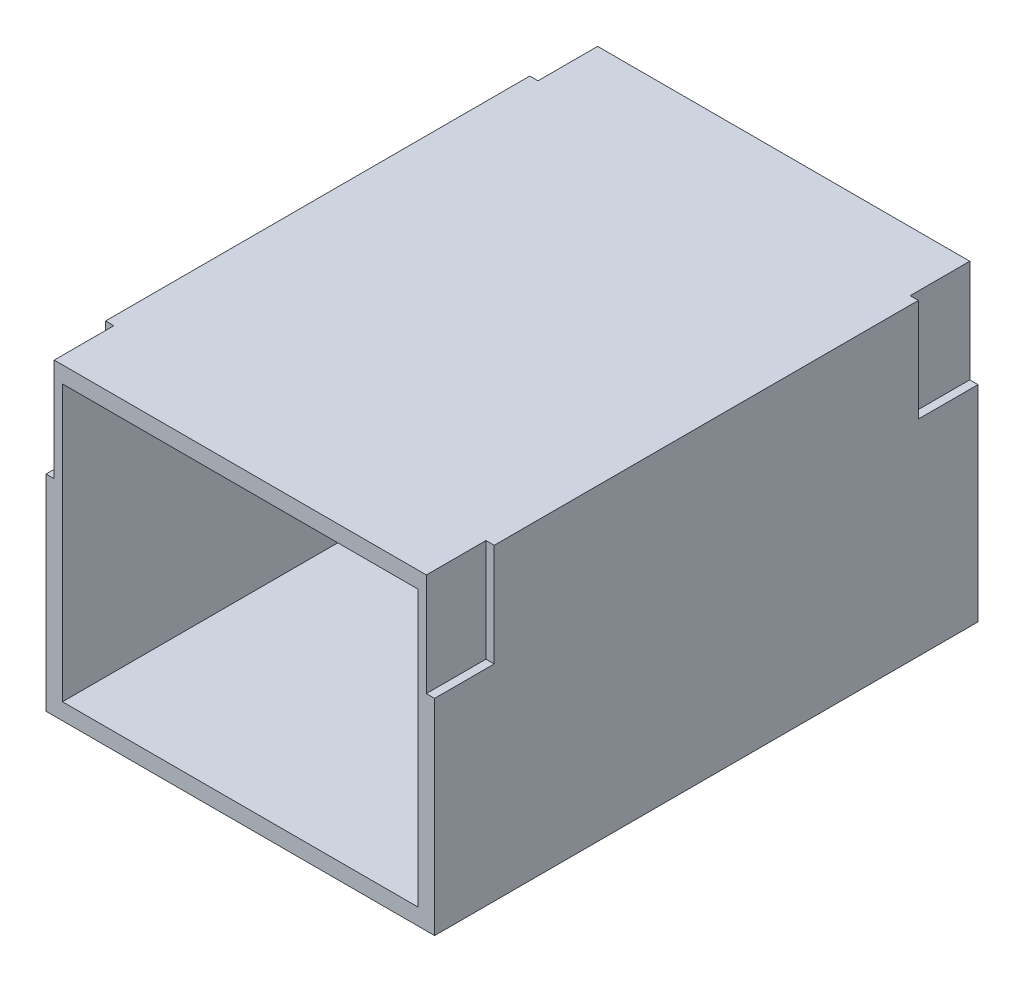
ISO-10303-21;
HEADER;
FILE_DESCRIPTION(('STEP AP214'),'2;1');
FILE_NAME('part.step','',(''),(''),'','','');
FILE_SCHEMA(('AUTOMOTIVE_DESIGN { 1 0 10303 214 1 1 1 1 }'));
ENDSEC;
DATA;
#1=APPLICATION_CONTEXT('core data for automotive mechanical design processes');
#2=APPLICATION_PROTOCOL_DEFINITION('international standard','automotive_design',2000,#1);
#3=PRODUCT_CONTEXT('',#1,'mechanical');
#4=PRODUCT('Part','Part','',(#3));
#5=PRODUCT_RELATED_PRODUCT_CATEGORY('part','',(#4));
#6=PRODUCT_DEFINITION_FORMATION('','',#4);
#7=PRODUCT_DEFINITION_CONTEXT('part definition',#1,'design');
#8=PRODUCT_DEFINITION('design','',#6,#7);
#9=PRODUCT_DEFINITION_SHAPE('','',#8);
#10=(LENGTH_UNIT() NAMED_UNIT(*) SI_UNIT(.MILLI.,.METRE.));
#11=(NAMED_UNIT(*) PLANE_ANGLE_UNIT() SI_UNIT($,.RADIAN.));
#12=(NAMED_UNIT(*) SI_UNIT($,.STERADIAN.) SOLID_ANGLE_UNIT());
#13=UNCERTAINTY_MEASURE_WITH_UNIT(LENGTH_MEASURE(1.E-05),#10,'distance_accuracy_value','');
#14=(GEOMETRIC_REPRESENTATION_CONTEXT(3) GLOBAL_UNCERTAINTY_ASSIGNED_CONTEXT((#13)) GLOBAL_UNIT_ASSIGNED_CONTEXT((#10,
#11,#12)) REPRESENTATION_CONTEXT('',''));
#15=CARTESIAN_POINT('',(0.,0.,0.));
#16=DIRECTION('',(0.,0.,1.));
#17=DIRECTION('',(1.,0.,0.));
#18=AXIS2_PLACEMENT_3D('',#15,#16,#17);
#19=CARTESIAN_POINT('',(3.175,56.261,-104.775));
#20=DIRECTION('',(-1.,0.,0.));
#21=DIRECTION('',(0.,0.,1.));
#22=AXIS2_PLACEMENT_3D('',#19,#20,#21);
#23=PLANE('',#22);
#24=DIRECTION('',(0.,1.,0.));
#25=VECTOR('',#24,1.);
#26=CARTESIAN_POINT('',(3.175,56.261,-103.1875));
#27=LINE('',#26,#25);
#28=CARTESIAN_POINT('',(3.175,3.175,-103.1875));
#29=VERTEX_POINT('',#28);
#30=CARTESIAN_POINT('',(3.175,56.261,-103.1875));
#31=VERTEX_POINT('',#30);
#32=EDGE_CURVE('E48',#29,#31,#27,.T.);
#33=ORIENTED_EDGE('',*,*,#32,.T.);
#34=DIRECTION('',(0.,0.,1.));
#35=VECTOR('',#34,1.);
#36=CARTESIAN_POINT('',(3.175,56.261,-104.775));
#37=LINE('',#36,#35);
#38=CARTESIAN_POINT('',(3.175,56.261,0.));
#39=VERTEX_POINT('',#38);
#40=EDGE_CURVE('E294',#31,#39,#37,.T.);
#41=ORIENTED_EDGE('',*,*,#40,.T.);
#42=DIRECTION('',(0.,-1.,0.));
#43=VECTOR('',#42,1.);
#44=CARTESIAN_POINT('',(3.175,56.261,0.));
#45=LINE('',#44,#43);
#46=CARTESIAN_POINT('',(3.175,3.175,0.));
#47=VERTEX_POINT('',#46);
#48=EDGE_CURVE('E281',#39,#47,#45,.T.);
#49=ORIENTED_EDGE('',*,*,#48,.T.);
#50=DIRECTION('',(0.,0.,1.));
#51=VECTOR('',#50,1.);
#52=CARTESIAN_POINT('',(3.175,3.175,-104.775));
#53=LINE('',#52,#51);
#54=EDGE_CURVE('E180',#29,#47,#53,.T.);
#55=ORIENTED_EDGE('',*,*,#54,.F.);
#56=EDGE_LOOP('',(#33,#41,#49,#55));
#57=FACE_BOUND('',#56,.T.);
#58=ADVANCED_FACE('F31',(#57),#23,.F.);
#59=CARTESIAN_POINT('',(71.755,56.261,-104.775));
#60=DIRECTION('',(0.,1.,0.));
#61=DIRECTION('',(0.,0.,1.));
#62=AXIS2_PLACEMENT_3D('',#59,#60,#61);
#63=PLANE('',#62);
#64=DIRECTION('',(1.,0.,0.));
#65=VECTOR('',#64,1.);
#66=CARTESIAN_POINT('',(71.755,56.261,-103.1875));
#67=LINE('',#66,#65);
#68=CARTESIAN_POINT('',(71.755,56.261,-103.1875));
#69=VERTEX_POINT('',#68);
#70=EDGE_CURVE('E55',#31,#69,#67,.T.);
#71=ORIENTED_EDGE('',*,*,#70,.T.);
#72=DIRECTION('',(0.,0.,1.));
#73=VECTOR('',#72,1.);
#74=CARTESIAN_POINT('',(71.755,56.261,-104.775));
#75=LINE('',#74,#73);
#76=CARTESIAN_POINT('',(71.755,56.261,0.));
#77=VERTEX_POINT('',#76);
#78=EDGE_CURVE('E179',#69,#77,#75,.T.);
#79=ORIENTED_EDGE('',*,*,#78,.T.);
#80=DIRECTION('',(-1.,0.,0.));
#81=VECTOR('',#80,1.);
#82=CARTESIAN_POINT('',(71.755,56.261,0.));
#83=LINE('',#82,#81);
#84=EDGE_CURVE('E291',#77,#39,#83,.T.);
#85=ORIENTED_EDGE('',*,*,#84,.T.);
#86=ORIENTED_EDGE('',*,*,#40,.F.);
#87=EDGE_LOOP('',(#71,#79,#85,#86));
#88=FACE_BOUND('',#87,.T.);
#89=ADVANCED_FACE('F388',(#88),#63,.F.);
#90=CARTESIAN_POINT('',(71.755,56.261,-104.775));
#91=DIRECTION('',(1.,0.,0.));
#92=DIRECTION('',(0.,0.,-1.));
#93=AXIS2_PLACEMENT_3D('',#90,#91,#92);
#94=PLANE('',#93);
#95=DIRECTION('',(0.,-1.,0.));
#96=VECTOR('',#95,1.);
#97=CARTESIAN_POINT('',(71.755,56.261,-103.1875));
#98=LINE('',#97,#96);
#99=CARTESIAN_POINT('',(71.755,3.175,-103.1875));
#100=VERTEX_POINT('',#99);
#101=EDGE_CURVE('E183',#69,#100,#98,.T.);
#102=ORIENTED_EDGE('',*,*,#101,.T.);
#103=DIRECTION('',(0.,0.,1.));
#104=VECTOR('',#103,1.);
#105=CARTESIAN_POINT('',(71.755,3.175,-104.775));
#106=LINE('',#105,#104);
#107=CARTESIAN_POINT('',(71.755,3.175,0.));
#108=VERTEX_POINT('',#107);
#109=EDGE_CURVE('E169',#100,#108,#106,.T.);
#110=ORIENTED_EDGE('',*,*,#109,.T.);
#111=DIRECTION('',(0.,1.,0.));
#112=VECTOR('',#111,1.);
#113=CARTESIAN_POINT('',(71.755,56.261,0.));
#114=LINE('',#113,#112);
#115=EDGE_CURVE('E289',#108,#77,#114,.T.);
#116=ORIENTED_EDGE('',*,*,#115,.T.);
#117=ORIENTED_EDGE('',*,*,#78,.F.);
#118=EDGE_LOOP('',(#102,#110,#116,#117));
#119=FACE_BOUND('',#118,.T.);
#120=ADVANCED_FACE('F184',(#119),#94,.F.);
#121=CARTESIAN_POINT('',(71.755,3.175,-104.775));
#122=DIRECTION('',(0.,-1.,0.));
#123=DIRECTION('',(1.,0.,0.));
#124=AXIS2_PLACEMENT_3D('',#121,#122,#123);
#125=PLANE('',#124);
#126=DIRECTION('',(-1.,0.,0.));
#127=VECTOR('',#126,1.);
#128=CARTESIAN_POINT('',(71.755,3.175,-103.1875));
#129=LINE('',#128,#127);
#130=EDGE_CURVE('E173',#100,#29,#129,.T.);
#131=ORIENTED_EDGE('',*,*,#130,.T.);
#132=ORIENTED_EDGE('',*,*,#54,.T.);
#133=DIRECTION('',(1.,0.,0.));
#134=VECTOR('',#133,1.);
#135=CARTESIAN_POINT('',(71.755,3.175,0.));
#136=LINE('',#135,#134);
#137=EDGE_CURVE('E175',#47,#108,#136,.T.);
#138=ORIENTED_EDGE('',*,*,#137,.T.);
#139=ORIENTED_EDGE('',*,*,#109,.F.);
#140=EDGE_LOOP('',(#131,#132,#138,#139));
#141=FACE_BOUND('',#140,.T.);
#142=ADVANCED_FACE('F171',(#141),#125,.F.);
#143=CARTESIAN_POINT('',(0.,0.,-104.775));
#144=DIRECTION('',(-1.,0.,0.));
#145=DIRECTION('',(0.,0.,1.));
#146=AXIS2_PLACEMENT_3D('',#143,#144,#145);
#147=PLANE('',#146);
#148=DIRECTION('',(0.,1.,0.));
#149=VECTOR('',#148,1.);
#150=CARTESIAN_POINT('',(0.,39.624,-93.2815));
#151=LINE('',#150,#149);
#152=CARTESIAN_POINT('',(0.,39.624,-93.2815));
#153=VERTEX_POINT('',#152);
#154=CARTESIAN_POINT('',(0.,59.436,-93.2815));
#155=VERTEX_POINT('',#154);
#156=EDGE_CURVE('E249',#153,#155,#151,.T.);
#157=ORIENTED_EDGE('',*,*,#156,.F.);
#158=DIRECTION('',(0.,0.,1.));
#159=VECTOR('',#158,1.);
#160=CARTESIAN_POINT('',(0.,39.624,-93.2815));
#161=LINE('',#160,#159);
#162=CARTESIAN_POINT('',(0.,39.624,-104.775));
#163=VERTEX_POINT('',#162);
#164=EDGE_CURVE('E238',#163,#153,#161,.T.);
#165=ORIENTED_EDGE('',*,*,#164,.F.);
#166=DIRECTION('',(0.,-1.,0.));
#167=VECTOR('',#166,1.);
#168=CARTESIAN_POINT('',(0.,0.,-104.775));
#169=LINE('',#168,#167);
#170=CARTESIAN_POINT('',(0.,0.,-104.775));
#171=VERTEX_POINT('',#170);
#172=EDGE_CURVE('E299',#163,#171,#169,.T.);
#173=ORIENTED_EDGE('',*,*,#172,.T.);
#174=DIRECTION('',(0.,0.,1.));
#175=VECTOR('',#174,1.);
#176=CARTESIAN_POINT('',(0.,0.,-104.775));
#177=LINE('',#176,#175);
#178=CARTESIAN_POINT('',(0.,0.,0.));
#179=VERTEX_POINT('',#178);
#180=EDGE_CURVE('E35',#171,#179,#177,.T.);
#181=ORIENTED_EDGE('',*,*,#180,.T.);
#182=DIRECTION('',(0.,-1.,0.));
#183=VECTOR('',#182,1.);
#184=CARTESIAN_POINT('',(0.,0.,0.));
#185=LINE('',#184,#183);
#186=CARTESIAN_POINT('',(0.,39.624,0.));
#187=VERTEX_POINT('',#186);
#188=EDGE_CURVE('E296',#187,#179,#185,.T.);
#189=ORIENTED_EDGE('',*,*,#188,.F.);
#190=DIRECTION('',(0.,0.,1.));
#191=VECTOR('',#190,1.);
#192=CARTESIAN_POINT('',(0.,39.624,-11.4935));
#193=LINE('',#192,#191);
#194=CARTESIAN_POINT('',(0.,39.624,-11.4935));
#195=VERTEX_POINT('',#194);
#196=EDGE_CURVE('E261',#195,#187,#193,.T.);
#197=ORIENTED_EDGE('',*,*,#196,.F.);
#198=DIRECTION('',(0.,1.,0.));
#199=VECTOR('',#198,1.);
#200=CARTESIAN_POINT('',(0.,39.624,-11.4935));
#201=LINE('',#200,#199);
#202=CARTESIAN_POINT('',(0.,59.436,-11.4935));
#203=VERTEX_POINT('',#202);
#204=EDGE_CURVE('E278',#195,#203,#201,.T.);
#205=ORIENTED_EDGE('',*,*,#204,.T.);
#206=DIRECTION('',(0.,0.,1.));
#207=VECTOR('',#206,1.);
#208=CARTESIAN_POINT('',(0.,59.436,-104.775));
#209=LINE('',#208,#207);
#210=EDGE_CURVE('E12',#155,#203,#209,.T.);
#211=ORIENTED_EDGE('',*,*,#210,.F.);
#212=EDGE_LOOP('',(#157,#165,#173,#181,#189,#197,#205,#211));
#213=FACE_BOUND('',#212,.T.);
#214=ADVANCED_FACE('F33',(#213),#147,.T.);
#215=CARTESIAN_POINT('',(0.,59.436,-104.775));
#216=DIRECTION('',(0.,1.,0.));
#217=DIRECTION('',(0.,0.,1.));
#218=AXIS2_PLACEMENT_3D('',#215,#216,#217);
#219=PLANE('',#218);
#220=DIRECTION('',(0.,0.,1.));
#221=VECTOR('',#220,1.);
#222=CARTESIAN_POINT('',(73.3425,59.436,-11.4935));
#223=LINE('',#222,#221);
#224=CARTESIAN_POINT('',(73.3425,59.436,-11.4935));
#225=VERTEX_POINT('',#224);
#226=CARTESIAN_POINT('',(73.3425,59.436,0.));
#227=VERTEX_POINT('',#226);
#228=EDGE_CURVE('E197',#225,#227,#223,.T.);
#229=ORIENTED_EDGE('',*,*,#228,.F.);
#230=DIRECTION('',(-1.,0.,0.));
#231=VECTOR('',#230,1.);
#232=CARTESIAN_POINT('',(73.3425,59.436,-11.4935));
#233=LINE('',#232,#231);
#234=CARTESIAN_POINT('',(74.93,59.436,-11.4935));
#235=VERTEX_POINT('',#234);
#236=EDGE_CURVE('E192',#235,#225,#233,.T.);
#237=ORIENTED_EDGE('',*,*,#236,.F.);
#238=DIRECTION('',(0.,0.,1.));
#239=VECTOR('',#238,1.);
#240=CARTESIAN_POINT('',(74.93,59.436,-104.775));
#241=LINE('',#240,#239);
#242=CARTESIAN_POINT('',(74.93,59.436,-93.2815));
#243=VERTEX_POINT('',#242);
#244=EDGE_CURVE('E40',#243,#235,#241,.T.);
#245=ORIENTED_EDGE('',*,*,#244,.F.);
#246=DIRECTION('',(1.,0.,0.));
#247=VECTOR('',#246,1.);
#248=CARTESIAN_POINT('',(73.3425,59.436,-93.2815));
#249=LINE('',#248,#247);
#250=CARTESIAN_POINT('',(73.3425,59.436,-93.2815));
#251=VERTEX_POINT('',#250);
#252=EDGE_CURVE('E218',#251,#243,#249,.T.);
#253=ORIENTED_EDGE('',*,*,#252,.F.);
#254=DIRECTION('',(0.,0.,1.));
#255=VECTOR('',#254,1.);
#256=CARTESIAN_POINT('',(73.3425,59.436,-93.2815));
#257=LINE('',#256,#255);
#258=CARTESIAN_POINT('',(73.3425,59.436,-104.775));
#259=VERTEX_POINT('',#258);
#260=EDGE_CURVE('E211',#259,#251,#257,.T.);
#261=ORIENTED_EDGE('',*,*,#260,.F.);
#262=DIRECTION('',(-1.,0.,0.));
#263=VECTOR('',#262,1.);
#264=CARTESIAN_POINT('',(0.,59.436,-104.775));
#265=LINE('',#264,#263);
#266=CARTESIAN_POINT('',(1.58749999999999,59.436,-104.775));
#267=VERTEX_POINT('',#266);
#268=EDGE_CURVE('E308',#259,#267,#265,.T.);
#269=ORIENTED_EDGE('',*,*,#268,.T.);
#270=DIRECTION('',(0.,0.,-1.));
#271=VECTOR('',#270,1.);
#272=CARTESIAN_POINT('',(1.58749999999999,59.436,-93.2815));
#273=LINE('',#272,#271);
#274=CARTESIAN_POINT('',(1.58749999999999,59.436,-93.2815));
#275=VERTEX_POINT('',#274);
#276=EDGE_CURVE('E242',#275,#267,#273,.T.);
#277=ORIENTED_EDGE('',*,*,#276,.F.);
#278=DIRECTION('',(1.,0.,0.));
#279=VECTOR('',#278,1.);
#280=CARTESIAN_POINT('',(1.58749999999999,59.436,-93.2815));
#281=LINE('',#280,#279);
#282=EDGE_CURVE('E234',#155,#275,#281,.T.);
#283=ORIENTED_EDGE('',*,*,#282,.F.);
#284=ORIENTED_EDGE('',*,*,#210,.T.);
#285=DIRECTION('',(-1.,0.,0.));
#286=VECTOR('',#285,1.);
#287=CARTESIAN_POINT('',(1.5875,59.436,-11.4935));
#288=LINE('',#287,#286);
#289=CARTESIAN_POINT('',(1.5875,59.436,-11.4935));
#290=VERTEX_POINT('',#289);
#291=EDGE_CURVE('E264',#290,#203,#288,.T.);
#292=ORIENTED_EDGE('',*,*,#291,.F.);
#293=DIRECTION('',(0.,0.,-1.));
#294=VECTOR('',#293,1.);
#295=CARTESIAN_POINT('',(1.5875,59.436,-11.4935));
#296=LINE('',#295,#294);
#297=CARTESIAN_POINT('',(1.58750000000001,59.436,0.));
#298=VERTEX_POINT('',#297);
#299=EDGE_CURVE('E257',#298,#290,#296,.T.);
#300=ORIENTED_EDGE('',*,*,#299,.F.);
#301=DIRECTION('',(-1.,0.,0.));
#302=VECTOR('',#301,1.);
#303=CARTESIAN_POINT('',(0.,59.436,0.));
#304=LINE('',#303,#302);
#305=EDGE_CURVE('E302',#227,#298,#304,.T.);
#306=ORIENTED_EDGE('',*,*,#305,.F.);
#307=EDGE_LOOP('',(#229,#237,#245,#253,#261,#269,#277,#283,#284,#292,#300,#306));
#308=FACE_BOUND('',#307,.T.);
#309=ADVANCED_FACE('F348',(#308),#219,.T.);
#310=CARTESIAN_POINT('',(74.93,0.,-104.775));
#311=DIRECTION('',(1.,0.,0.));
#312=DIRECTION('',(0.,0.,-1.));
#313=AXIS2_PLACEMENT_3D('',#310,#311,#312);
#314=PLANE('',#313);
#315=DIRECTION('',(0.,1.,0.));
#316=VECTOR('',#315,1.);
#317=CARTESIAN_POINT('',(74.93,39.624,-11.4935));
#318=LINE('',#317,#316);
#319=CARTESIAN_POINT('',(74.93,39.624,-11.4935));
#320=VERTEX_POINT('',#319);
#321=EDGE_CURVE('E204',#320,#235,#318,.T.);
#322=ORIENTED_EDGE('',*,*,#321,.F.);
#323=DIRECTION('',(0.,0.,-1.));
#324=VECTOR('',#323,1.);
#325=CARTESIAN_POINT('',(74.93,39.624,-11.4935));
#326=LINE('',#325,#324);
#327=CARTESIAN_POINT('',(74.93,39.624,0.));
#328=VERTEX_POINT('',#327);
#329=EDGE_CURVE('E193',#328,#320,#326,.T.);
#330=ORIENTED_EDGE('',*,*,#329,.F.);
#331=DIRECTION('',(0.,1.,0.));
#332=VECTOR('',#331,1.);
#333=CARTESIAN_POINT('',(74.93,0.,0.));
#334=LINE('',#333,#332);
#335=CARTESIAN_POINT('',(74.93,0.,0.));
#336=VERTEX_POINT('',#335);
#337=EDGE_CURVE('E314',#336,#328,#334,.T.);
#338=ORIENTED_EDGE('',*,*,#337,.F.);
#339=DIRECTION('',(0.,0.,1.));
#340=VECTOR('',#339,1.);
#341=CARTESIAN_POINT('',(74.93,0.,-104.775));
#342=LINE('',#341,#340);
#343=CARTESIAN_POINT('',(74.93,0.,-104.775));
#344=VERTEX_POINT('',#343);
#345=EDGE_CURVE('E319',#344,#336,#342,.T.);
#346=ORIENTED_EDGE('',*,*,#345,.F.);
#347=DIRECTION('',(0.,1.,0.));
#348=VECTOR('',#347,1.);
#349=CARTESIAN_POINT('',(74.93,0.,-104.775));
#350=LINE('',#349,#348);
#351=CARTESIAN_POINT('',(74.93,39.624,-104.775));
#352=VERTEX_POINT('',#351);
#353=EDGE_CURVE('E305',#344,#352,#350,.T.);
#354=ORIENTED_EDGE('',*,*,#353,.T.);
#355=DIRECTION('',(0.,0.,-1.));
#356=VECTOR('',#355,1.);
#357=CARTESIAN_POINT('',(74.93,39.624,-93.2815));
#358=LINE('',#357,#356);
#359=CARTESIAN_POINT('',(74.93,39.624,-93.2815));
#360=VERTEX_POINT('',#359);
#361=EDGE_CURVE('E215',#360,#352,#358,.T.);
#362=ORIENTED_EDGE('',*,*,#361,.F.);
#363=DIRECTION('',(0.,1.,0.));
#364=VECTOR('',#363,1.);
#365=CARTESIAN_POINT('',(74.93,39.624,-93.2815));
#366=LINE('',#365,#364);
#367=EDGE_CURVE('E231',#360,#243,#366,.T.);
#368=ORIENTED_EDGE('',*,*,#367,.T.);
#369=ORIENTED_EDGE('',*,*,#244,.T.);
#370=EDGE_LOOP('',(#322,#330,#338,#346,#354,#362,#368,#369));
#371=FACE_BOUND('',#370,.T.);
#372=ADVANCED_FACE('F365',(#371),#314,.T.);
#373=CARTESIAN_POINT('',(0.,0.,-104.775));
#374=DIRECTION('',(0.,-1.,0.));
#375=DIRECTION('',(0.,0.,-1.));
#376=AXIS2_PLACEMENT_3D('',#373,#374,#375);
#377=PLANE('',#376);
#378=DIRECTION('',(1.,0.,0.));
#379=VECTOR('',#378,1.);
#380=CARTESIAN_POINT('',(0.,0.,0.));
#381=LINE('',#380,#379);
#382=EDGE_CURVE('E311',#179,#336,#381,.T.);
#383=ORIENTED_EDGE('',*,*,#382,.F.);
#384=ORIENTED_EDGE('',*,*,#180,.F.);
#385=DIRECTION('',(1.,0.,0.));
#386=VECTOR('',#385,1.);
#387=CARTESIAN_POINT('',(0.,0.,-104.775));
#388=LINE('',#387,#386);
#389=EDGE_CURVE('E301',#171,#344,#388,.T.);
#390=ORIENTED_EDGE('',*,*,#389,.T.);
#391=ORIENTED_EDGE('',*,*,#345,.T.);
#392=EDGE_LOOP('',(#383,#384,#390,#391));
#393=FACE_BOUND('',#392,.T.);
#394=ADVANCED_FACE('F332',(#393),#377,.T.);
#395=CARTESIAN_POINT('',(0.,59.436,-104.775));
#396=DIRECTION('',(0.,0.,-1.));
#397=DIRECTION('',(-1.,0.,0.));
#398=AXIS2_PLACEMENT_3D('',#395,#396,#397);
#399=PLANE('',#398);
#400=DIRECTION('',(0.,1.,0.));
#401=VECTOR('',#400,1.);
#402=CARTESIAN_POINT('',(73.3425,39.624,-104.775));
#403=LINE('',#402,#401);
#404=CARTESIAN_POINT('',(73.3425,39.624,-104.775));
#405=VERTEX_POINT('',#404);
#406=EDGE_CURVE('E227',#405,#259,#403,.T.);
#407=ORIENTED_EDGE('',*,*,#406,.F.);
#408=DIRECTION('',(-1.,0.,0.));
#409=VECTOR('',#408,1.);
#410=CARTESIAN_POINT('',(73.3425,39.624,-104.775));
#411=LINE('',#410,#409);
#412=EDGE_CURVE('E217',#352,#405,#411,.T.);
#413=ORIENTED_EDGE('',*,*,#412,.F.);
#414=ORIENTED_EDGE('',*,*,#353,.F.);
#415=ORIENTED_EDGE('',*,*,#389,.F.);
#416=ORIENTED_EDGE('',*,*,#172,.F.);
#417=DIRECTION('',(-1.,0.,0.));
#418=VECTOR('',#417,1.);
#419=CARTESIAN_POINT('',(1.58749999999999,39.624,-104.775));
#420=LINE('',#419,#418);
#421=CARTESIAN_POINT('',(1.58749999999999,39.624,-104.775));
#422=VERTEX_POINT('',#421);
#423=EDGE_CURVE('E247',#422,#163,#420,.T.);
#424=ORIENTED_EDGE('',*,*,#423,.F.);
#425=DIRECTION('',(0.,1.,0.));
#426=VECTOR('',#425,1.);
#427=CARTESIAN_POINT('',(1.58749999999999,39.624,-104.775));
#428=LINE('',#427,#426);
#429=EDGE_CURVE('E254',#422,#267,#428,.T.);
#430=ORIENTED_EDGE('',*,*,#429,.T.);
#431=ORIENTED_EDGE('',*,*,#268,.F.);
#432=EDGE_LOOP('',(#407,#413,#414,#415,#416,#424,#430,#431));
#433=FACE_BOUND('',#432,.T.);
#434=ADVANCED_FACE('F359',(#433),#399,.T.);
#435=CARTESIAN_POINT('',(0.,59.436,0.));
#436=DIRECTION('',(0.,0.,-1.));
#437=DIRECTION('',(-1.,0.,0.));
#438=AXIS2_PLACEMENT_3D('',#435,#436,#437);
#439=PLANE('',#438);
#440=ORIENTED_EDGE('',*,*,#137,.F.);
#441=ORIENTED_EDGE('',*,*,#48,.F.);
#442=ORIENTED_EDGE('',*,*,#84,.F.);
#443=ORIENTED_EDGE('',*,*,#115,.F.);
#444=EDGE_LOOP('',(#440,#441,#442,#443));
#445=FACE_BOUND('',#444,.T.);
#446=DIRECTION('',(1.,0.,0.));
#447=VECTOR('',#446,1.);
#448=CARTESIAN_POINT('',(73.3425,39.624,0.));
#449=LINE('',#448,#447);
#450=CARTESIAN_POINT('',(73.3425,39.624,0.));
#451=VERTEX_POINT('',#450);
#452=EDGE_CURVE('E202',#451,#328,#449,.T.);
#453=ORIENTED_EDGE('',*,*,#452,.F.);
#454=DIRECTION('',(0.,1.,0.));
#455=VECTOR('',#454,1.);
#456=CARTESIAN_POINT('',(73.3425,39.624,0.));
#457=LINE('',#456,#455);
#458=EDGE_CURVE('E208',#451,#227,#457,.T.);
#459=ORIENTED_EDGE('',*,*,#458,.T.);
#460=ORIENTED_EDGE('',*,*,#305,.T.);
#461=DIRECTION('',(0.,1.,0.));
#462=VECTOR('',#461,1.);
#463=CARTESIAN_POINT('',(1.58750000000001,39.624,0.));
#464=LINE('',#463,#462);
#465=CARTESIAN_POINT('',(1.58750000000001,39.624,0.));
#466=VERTEX_POINT('',#465);
#467=EDGE_CURVE('E273',#466,#298,#464,.T.);
#468=ORIENTED_EDGE('',*,*,#467,.F.);
#469=DIRECTION('',(1.,0.,0.));
#470=VECTOR('',#469,1.);
#471=CARTESIAN_POINT('',(1.58750000000001,39.624,0.));
#472=LINE('',#471,#470);
#473=EDGE_CURVE('E263',#187,#466,#472,.T.);
#474=ORIENTED_EDGE('',*,*,#473,.F.);
#475=ORIENTED_EDGE('',*,*,#188,.T.);
#476=ORIENTED_EDGE('',*,*,#382,.T.);
#477=ORIENTED_EDGE('',*,*,#337,.T.);
#478=EDGE_LOOP('',(#453,#459,#460,#468,#474,#475,#476,#477));
#479=FACE_BOUND('',#478,.T.);
#480=ADVANCED_FACE('F335',(#445,#479),#439,.F.);
#481=CARTESIAN_POINT('',(1.5875,39.624,-11.4935));
#482=DIRECTION('',(0.,0.,-1.));
#483=DIRECTION('',(-1.,0.,0.));
#484=AXIS2_PLACEMENT_3D('',#481,#482,#483);
#485=PLANE('',#484);
#486=ORIENTED_EDGE('',*,*,#291,.T.);
#487=ORIENTED_EDGE('',*,*,#204,.F.);
#488=DIRECTION('',(-1.,0.,0.));
#489=VECTOR('',#488,1.);
#490=CARTESIAN_POINT('',(1.5875,39.624,-11.4935));
#491=LINE('',#490,#489);
#492=CARTESIAN_POINT('',(1.5875,39.624,-11.4935));
#493=VERTEX_POINT('',#492);
#494=EDGE_CURVE('E270',#493,#195,#491,.T.);
#495=ORIENTED_EDGE('',*,*,#494,.F.);
#496=DIRECTION('',(0.,1.,0.));
#497=VECTOR('',#496,1.);
#498=CARTESIAN_POINT('',(1.5875,39.624,-11.4935));
#499=LINE('',#498,#497);
#500=EDGE_CURVE('E282',#493,#290,#499,.T.);
#501=ORIENTED_EDGE('',*,*,#500,.T.);
#502=EDGE_LOOP('',(#486,#487,#495,#501));
#503=FACE_BOUND('',#502,.T.);
#504=ADVANCED_FACE('F343',(#503),#485,.F.);
#505=CARTESIAN_POINT('',(1.5875,39.624,-11.4935));
#506=DIRECTION('',(1.,0.,0.));
#507=DIRECTION('',(0.,0.,-1.));
#508=AXIS2_PLACEMENT_3D('',#505,#506,#507);
#509=PLANE('',#508);
#510=ORIENTED_EDGE('',*,*,#299,.T.);
#511=ORIENTED_EDGE('',*,*,#500,.F.);
#512=DIRECTION('',(0.,0.,-1.));
#513=VECTOR('',#512,1.);
#514=CARTESIAN_POINT('',(1.5875,39.624,-11.4935));
#515=LINE('',#514,#513);
#516=EDGE_CURVE('E267',#466,#493,#515,.T.);
#517=ORIENTED_EDGE('',*,*,#516,.F.);
#518=ORIENTED_EDGE('',*,*,#467,.T.);
#519=EDGE_LOOP('',(#510,#511,#517,#518));
#520=FACE_BOUND('',#519,.T.);
#521=ADVANCED_FACE('F427',(#520),#509,.F.);
#522=CARTESIAN_POINT('',(0.,39.624,0.));
#523=DIRECTION('',(0.,-1.,0.));
#524=DIRECTION('',(0.,0.,-1.));
#525=AXIS2_PLACEMENT_3D('',#522,#523,#524);
#526=PLANE('',#525);
#527=ORIENTED_EDGE('',*,*,#196,.T.);
#528=ORIENTED_EDGE('',*,*,#473,.T.);
#529=ORIENTED_EDGE('',*,*,#516,.T.);
#530=ORIENTED_EDGE('',*,*,#494,.T.);
#531=EDGE_LOOP('',(#527,#528,#529,#530));
#532=FACE_BOUND('',#531,.T.);
#533=ADVANCED_FACE('F339',(#532),#526,.F.);
#534=CARTESIAN_POINT('',(1.58749999999999,39.624,-93.2815));
#535=DIRECTION('',(1.,0.,0.));
#536=DIRECTION('',(0.,0.,-1.));
#537=AXIS2_PLACEMENT_3D('',#534,#535,#536);
#538=PLANE('',#537);
#539=ORIENTED_EDGE('',*,*,#276,.T.);
#540=ORIENTED_EDGE('',*,*,#429,.F.);
#541=DIRECTION('',(0.,0.,-1.));
#542=VECTOR('',#541,1.);
#543=CARTESIAN_POINT('',(1.58749999999999,39.624,-93.2815));
#544=LINE('',#543,#542);
#545=CARTESIAN_POINT('',(1.58749999999999,39.624,-93.2815));
#546=VERTEX_POINT('',#545);
#547=EDGE_CURVE('E245',#546,#422,#544,.T.);
#548=ORIENTED_EDGE('',*,*,#547,.F.);
#549=DIRECTION('',(0.,1.,0.));
#550=VECTOR('',#549,1.);
#551=CARTESIAN_POINT('',(1.58749999999999,39.624,-93.2815));
#552=LINE('',#551,#550);
#553=EDGE_CURVE('E258',#546,#275,#552,.T.);
#554=ORIENTED_EDGE('',*,*,#553,.T.);
#555=EDGE_LOOP('',(#539,#540,#548,#554));
#556=FACE_BOUND('',#555,.T.);
#557=ADVANCED_FACE('F441',(#556),#538,.F.);
#558=CARTESIAN_POINT('',(1.58749999999999,39.624,-93.2815));
#559=DIRECTION('',(0.,0.,1.));
#560=DIRECTION('',(1.,0.,0.));
#561=AXIS2_PLACEMENT_3D('',#558,#559,#560);
#562=PLANE('',#561);
#563=ORIENTED_EDGE('',*,*,#282,.T.);
#564=ORIENTED_EDGE('',*,*,#553,.F.);
#565=DIRECTION('',(1.,0.,0.));
#566=VECTOR('',#565,1.);
#567=CARTESIAN_POINT('',(1.58749999999999,39.624,-93.2815));
#568=LINE('',#567,#566);
#569=EDGE_CURVE('E241',#153,#546,#568,.T.);
#570=ORIENTED_EDGE('',*,*,#569,.F.);
#571=ORIENTED_EDGE('',*,*,#156,.T.);
#572=EDGE_LOOP('',(#563,#564,#570,#571));
#573=FACE_BOUND('',#572,.T.);
#574=ADVANCED_FACE('F353',(#573),#562,.F.);
#575=CARTESIAN_POINT('',(0.,39.624,-104.775));
#576=DIRECTION('',(0.,1.,0.));
#577=DIRECTION('',(0.,0.,1.));
#578=AXIS2_PLACEMENT_3D('',#575,#576,#577);
#579=PLANE('',#578);
#580=ORIENTED_EDGE('',*,*,#164,.T.);
#581=ORIENTED_EDGE('',*,*,#569,.T.);
#582=ORIENTED_EDGE('',*,*,#547,.T.);
#583=ORIENTED_EDGE('',*,*,#423,.T.);
#584=EDGE_LOOP('',(#580,#581,#582,#583));
#585=FACE_BOUND('',#584,.T.);
#586=ADVANCED_FACE('F455',(#585),#579,.T.);
#587=CARTESIAN_POINT('',(73.3425,39.624,-93.2815));
#588=DIRECTION('',(0.,0.,1.));
#589=DIRECTION('',(1.,0.,0.));
#590=AXIS2_PLACEMENT_3D('',#587,#588,#589);
#591=PLANE('',#590);
#592=ORIENTED_EDGE('',*,*,#252,.T.);
#593=ORIENTED_EDGE('',*,*,#367,.F.);
#594=DIRECTION('',(1.,0.,0.));
#595=VECTOR('',#594,1.);
#596=CARTESIAN_POINT('',(73.3425,39.624,-93.2815));
#597=LINE('',#596,#595);
#598=CARTESIAN_POINT('',(73.3425,39.624,-93.2815));
#599=VERTEX_POINT('',#598);
#600=EDGE_CURVE('E224',#599,#360,#597,.T.);
#601=ORIENTED_EDGE('',*,*,#600,.F.);
#602=DIRECTION('',(0.,1.,0.));
#603=VECTOR('',#602,1.);
#604=CARTESIAN_POINT('',(73.3425,39.624,-93.2815));
#605=LINE('',#604,#603);
#606=EDGE_CURVE('E235',#599,#251,#605,.T.);
#607=ORIENTED_EDGE('',*,*,#606,.T.);
#608=EDGE_LOOP('',(#592,#593,#601,#607));
#609=FACE_BOUND('',#608,.T.);
#610=ADVANCED_FACE('F462',(#609),#591,.F.);
#611=CARTESIAN_POINT('',(73.3425,39.624,-93.2815));
#612=DIRECTION('',(-1.,0.,0.));
#613=DIRECTION('',(0.,0.,1.));
#614=AXIS2_PLACEMENT_3D('',#611,#612,#613);
#615=PLANE('',#614);
#616=ORIENTED_EDGE('',*,*,#260,.T.);
#617=ORIENTED_EDGE('',*,*,#606,.F.);
#618=DIRECTION('',(0.,0.,1.));
#619=VECTOR('',#618,1.);
#620=CARTESIAN_POINT('',(73.3425,39.624,-93.2815));
#621=LINE('',#620,#619);
#622=EDGE_CURVE('E221',#405,#599,#621,.T.);
#623=ORIENTED_EDGE('',*,*,#622,.F.);
#624=ORIENTED_EDGE('',*,*,#406,.T.);
#625=EDGE_LOOP('',(#616,#617,#623,#624));
#626=FACE_BOUND('',#625,.T.);
#627=ADVANCED_FACE('F469',(#626),#615,.F.);
#628=CARTESIAN_POINT('',(74.93,39.624,-104.775));
#629=DIRECTION('',(0.,-1.,0.));
#630=DIRECTION('',(0.,0.,-1.));
#631=AXIS2_PLACEMENT_3D('',#628,#629,#630);
#632=PLANE('',#631);
#633=ORIENTED_EDGE('',*,*,#361,.T.);
#634=ORIENTED_EDGE('',*,*,#412,.T.);
#635=ORIENTED_EDGE('',*,*,#622,.T.);
#636=ORIENTED_EDGE('',*,*,#600,.T.);
#637=EDGE_LOOP('',(#633,#634,#635,#636));
#638=FACE_BOUND('',#637,.T.);
#639=ADVANCED_FACE('F384',(#638),#632,.F.);
#640=CARTESIAN_POINT('',(73.3425,39.624,-11.4935));
#641=DIRECTION('',(-1.,0.,0.));
#642=DIRECTION('',(0.,0.,1.));
#643=AXIS2_PLACEMENT_3D('',#640,#641,#642);
#644=PLANE('',#643);
#645=ORIENTED_EDGE('',*,*,#228,.T.);
#646=ORIENTED_EDGE('',*,*,#458,.F.);
#647=DIRECTION('',(0.,0.,1.));
#648=VECTOR('',#647,1.);
#649=CARTESIAN_POINT('',(73.3425,39.624,-11.4935));
#650=LINE('',#649,#648);
#651=CARTESIAN_POINT('',(73.3425,39.624,-11.4935));
#652=VERTEX_POINT('',#651);
#653=EDGE_CURVE('E200',#652,#451,#650,.T.);
#654=ORIENTED_EDGE('',*,*,#653,.F.);
#655=DIRECTION('',(0.,1.,0.));
#656=VECTOR('',#655,1.);
#657=CARTESIAN_POINT('',(73.3425,39.624,-11.4935));
#658=LINE('',#657,#656);
#659=EDGE_CURVE('E212',#652,#225,#658,.T.);
#660=ORIENTED_EDGE('',*,*,#659,.T.);
#661=EDGE_LOOP('',(#645,#646,#654,#660));
#662=FACE_BOUND('',#661,.T.);
#663=ADVANCED_FACE('F374',(#662),#644,.F.);
#664=CARTESIAN_POINT('',(73.3425,39.624,-11.4935));
#665=DIRECTION('',(0.,0.,-1.));
#666=DIRECTION('',(-1.,0.,0.));
#667=AXIS2_PLACEMENT_3D('',#664,#665,#666);
#668=PLANE('',#667);
#669=ORIENTED_EDGE('',*,*,#236,.T.);
#670=ORIENTED_EDGE('',*,*,#659,.F.);
#671=DIRECTION('',(-1.,0.,0.));
#672=VECTOR('',#671,1.);
#673=CARTESIAN_POINT('',(73.3425,39.624,-11.4935));
#674=LINE('',#673,#672);
#675=EDGE_CURVE('E196',#320,#652,#674,.T.);
#676=ORIENTED_EDGE('',*,*,#675,.F.);
#677=ORIENTED_EDGE('',*,*,#321,.T.);
#678=EDGE_LOOP('',(#669,#670,#676,#677));
#679=FACE_BOUND('',#678,.T.);
#680=ADVANCED_FACE('F376',(#679),#668,.F.);
#681=CARTESIAN_POINT('',(74.93,39.624,0.));
#682=DIRECTION('',(0.,1.,0.));
#683=DIRECTION('',(0.,0.,1.));
#684=AXIS2_PLACEMENT_3D('',#681,#682,#683);
#685=PLANE('',#684);
#686=ORIENTED_EDGE('',*,*,#329,.T.);
#687=ORIENTED_EDGE('',*,*,#675,.T.);
#688=ORIENTED_EDGE('',*,*,#653,.T.);
#689=ORIENTED_EDGE('',*,*,#452,.T.);
#690=EDGE_LOOP('',(#686,#687,#688,#689));
#691=FACE_BOUND('',#690,.T.);
#692=ADVANCED_FACE('F368',(#691),#685,.T.);
#693=CARTESIAN_POINT('',(71.755,3.175,-103.1875));
#694=DIRECTION('',(0.,0.,-1.));
#695=DIRECTION('',(-1.,0.,0.));
#696=AXIS2_PLACEMENT_3D('',#693,#694,#695);
#697=PLANE('',#696);
#698=ORIENTED_EDGE('',*,*,#101,.F.);
#699=ORIENTED_EDGE('',*,*,#70,.F.);
#700=ORIENTED_EDGE('',*,*,#32,.F.);
#701=ORIENTED_EDGE('',*,*,#130,.F.);
#702=EDGE_LOOP('',(#698,#699,#700,#701));
#703=FACE_BOUND('',#702,.T.);
#704=ADVANCED_FACE('F187',(#703),#697,.F.);
#705=CLOSED_SHELL('',(#58,#89,#120,#142,#214,#309,#372,#394,#434,#480,#504,#521,#533,#557,#574,
#586,#610,#627,#639,#663,#680,#692,#704));
#706=MANIFOLD_SOLID_BREP('B2',#705);
#707=ADVANCED_BREP_SHAPE_REPRESENTATION('',(#18,#706),#14);
#708=SHAPE_DEFINITION_REPRESENTATION(#9,#707);
ENDSEC;
END-ISO-10303-21;
